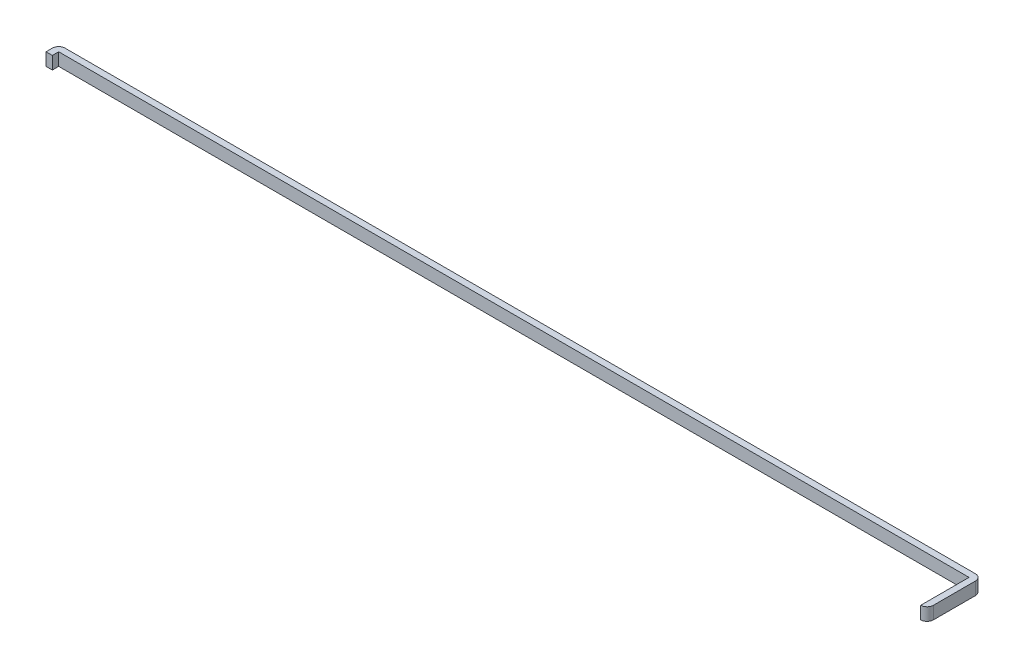
ISO-10303-21;
HEADER;
FILE_DESCRIPTION(('STEP AP214'),'2;1');
FILE_NAME('part.step','',(''),(''),'','','');
FILE_SCHEMA(('AUTOMOTIVE_DESIGN { 1 0 10303 214 1 1 1 1 }'));
ENDSEC;
DATA;
#1=APPLICATION_CONTEXT('core data for automotive mechanical design processes');
#2=APPLICATION_PROTOCOL_DEFINITION('international standard','automotive_design',2000,#1);
#3=PRODUCT_CONTEXT('',#1,'mechanical');
#4=PRODUCT('Part','Part','',(#3));
#5=PRODUCT_RELATED_PRODUCT_CATEGORY('part','',(#4));
#6=PRODUCT_DEFINITION_FORMATION('','',#4);
#7=PRODUCT_DEFINITION_CONTEXT('part definition',#1,'design');
#8=PRODUCT_DEFINITION('design','',#6,#7);
#9=PRODUCT_DEFINITION_SHAPE('','',#8);
#10=(LENGTH_UNIT() NAMED_UNIT(*) SI_UNIT(.MILLI.,.METRE.));
#11=(NAMED_UNIT(*) PLANE_ANGLE_UNIT() SI_UNIT($,.RADIAN.));
#12=(NAMED_UNIT(*) SI_UNIT($,.STERADIAN.) SOLID_ANGLE_UNIT());
#13=UNCERTAINTY_MEASURE_WITH_UNIT(LENGTH_MEASURE(1.E-05),#10,'distance_accuracy_value','');
#14=(GEOMETRIC_REPRESENTATION_CONTEXT(3) GLOBAL_UNCERTAINTY_ASSIGNED_CONTEXT((#13)) GLOBAL_UNIT_ASSIGNED_CONTEXT((#10,
#11,#12)) REPRESENTATION_CONTEXT('',''));
#15=CARTESIAN_POINT('',(0.,0.,0.));
#16=DIRECTION('',(0.,0.,1.));
#17=DIRECTION('',(1.,0.,0.));
#18=AXIS2_PLACEMENT_3D('',#15,#16,#17);
#19=CARTESIAN_POINT('',(-14.366,-5.00619,0.20019));
#20=DIRECTION('',(0.,0.,-1.));
#21=DIRECTION('',(-1.,0.,0.));
#22=AXIS2_PLACEMENT_3D('',#19,#20,#21);
#23=PLANE('',#22);
#24=DIRECTION('',(0.,1.,0.));
#25=VECTOR('',#24,1.);
#26=CARTESIAN_POINT('',(14.376,-5.00619,0.20019));
#27=LINE('',#26,#25);
#28=CARTESIAN_POINT('',(14.376,-5.00619,0.20019));
#29=VERTEX_POINT('',#28);
#30=CARTESIAN_POINT('',(14.376,-4.60581,0.20019));
#31=VERTEX_POINT('',#30);
#32=EDGE_CURVE('E125',#29,#31,#27,.T.);
#33=ORIENTED_EDGE('',*,*,#32,.T.);
#34=DIRECTION('',(1.,0.,0.));
#35=VECTOR('',#34,1.);
#36=CARTESIAN_POINT('',(14.376,-4.60581,0.20019));
#37=LINE('',#36,#35);
#38=CARTESIAN_POINT('',(-14.366,-4.60581,0.20019));
#39=VERTEX_POINT('',#38);
#40=EDGE_CURVE('E112',#31,#39,#37,.F.);
#41=ORIENTED_EDGE('',*,*,#40,.T.);
#42=DIRECTION('',(0.,1.,0.));
#43=VECTOR('',#42,1.);
#44=CARTESIAN_POINT('',(-14.366,-5.00619,0.20019));
#45=LINE('',#44,#43);
#46=CARTESIAN_POINT('',(-14.366,-5.00619,0.20019));
#47=VERTEX_POINT('',#46);
#48=EDGE_CURVE('E108',#39,#47,#45,.F.);
#49=ORIENTED_EDGE('',*,*,#48,.T.);
#50=DIRECTION('',(1.,0.,0.));
#51=VECTOR('',#50,1.);
#52=CARTESIAN_POINT('',(14.376,-5.00619,0.20019));
#53=LINE('',#52,#51);
#54=EDGE_CURVE('E126',#29,#47,#53,.F.);
#55=ORIENTED_EDGE('',*,*,#54,.F.);
#56=EDGE_LOOP('',(#33,#41,#49,#55));
#57=FACE_BOUND('',#56,.T.);
#58=ADVANCED_FACE('F17',(#57),#23,.F.);
#59=CARTESIAN_POINT('',(-14.366,-5.00619,0.40038));
#60=DIRECTION('',(-1.,0.,0.));
#61=DIRECTION('',(0.,0.,1.));
#62=AXIS2_PLACEMENT_3D('',#59,#60,#61);
#63=PLANE('',#62);
#64=ORIENTED_EDGE('',*,*,#48,.F.);
#65=DIRECTION('',(0.,0.,-1.));
#66=VECTOR('',#65,1.);
#67=CARTESIAN_POINT('',(-14.366,-4.60581,0.20019));
#68=LINE('',#67,#66);
#69=CARTESIAN_POINT('',(-14.366,-4.60581,0.40038));
#70=VERTEX_POINT('',#69);
#71=EDGE_CURVE('E120',#39,#70,#68,.F.);
#72=ORIENTED_EDGE('',*,*,#71,.T.);
#73=DIRECTION('',(0.,1.,0.));
#74=VECTOR('',#73,1.);
#75=CARTESIAN_POINT('',(-14.366,-5.00619,0.40038));
#76=LINE('',#75,#74);
#77=CARTESIAN_POINT('',(-14.366,-5.00619,0.40038));
#78=VERTEX_POINT('',#77);
#79=EDGE_CURVE('E177',#70,#78,#76,.F.);
#80=ORIENTED_EDGE('',*,*,#79,.T.);
#81=DIRECTION('',(0.,0.,-1.));
#82=VECTOR('',#81,1.);
#83=CARTESIAN_POINT('',(-14.366,-5.00619,0.20019));
#84=LINE('',#83,#82);
#85=EDGE_CURVE('E168',#47,#78,#84,.F.);
#86=ORIENTED_EDGE('',*,*,#85,.F.);
#87=EDGE_LOOP('',(#64,#72,#80,#86));
#88=FACE_BOUND('',#87,.T.);
#89=ADVANCED_FACE('F227',(#88),#63,.F.);
#90=CARTESIAN_POINT('',(-14.56619,-5.00619,0.40038));
#91=DIRECTION('',(0.,0.,-1.));
#92=DIRECTION('',(-1.,0.,0.));
#93=AXIS2_PLACEMENT_3D('',#90,#91,#92);
#94=PLANE('',#93);
#95=ORIENTED_EDGE('',*,*,#79,.F.);
#96=DIRECTION('',(1.,0.,0.));
#97=VECTOR('',#96,1.);
#98=CARTESIAN_POINT('',(14.376,-4.60581,0.40038));
#99=LINE('',#98,#97);
#100=CARTESIAN_POINT('',(-14.56619,-4.60581,0.40038));
#101=VERTEX_POINT('',#100);
#102=EDGE_CURVE('E145',#70,#101,#99,.F.);
#103=ORIENTED_EDGE('',*,*,#102,.T.);
#104=DIRECTION('',(0.,1.,0.));
#105=VECTOR('',#104,1.);
#106=CARTESIAN_POINT('',(-14.56619,-5.00619,0.40038));
#107=LINE('',#106,#105);
#108=CARTESIAN_POINT('',(-14.56619,-5.00619,0.40038));
#109=VERTEX_POINT('',#108);
#110=EDGE_CURVE('E184',#101,#109,#107,.F.);
#111=ORIENTED_EDGE('',*,*,#110,.T.);
#112=DIRECTION('',(1.,0.,0.));
#113=VECTOR('',#112,1.);
#114=CARTESIAN_POINT('',(14.376,-5.00619,0.40038));
#115=LINE('',#114,#113);
#116=EDGE_CURVE('E86',#78,#109,#115,.F.);
#117=ORIENTED_EDGE('',*,*,#116,.F.);
#118=EDGE_LOOP('',(#95,#103,#111,#117));
#119=FACE_BOUND('',#118,.T.);
#120=ADVANCED_FACE('F226',(#119),#94,.F.);
#121=CARTESIAN_POINT('',(-14.56619,-5.00619,0.20019));
#122=DIRECTION('',(1.,0.,0.));
#123=DIRECTION('',(0.,0.,-1.));
#124=AXIS2_PLACEMENT_3D('',#121,#122,#123);
#125=PLANE('',#124);
#126=ORIENTED_EDGE('',*,*,#110,.F.);
#127=DIRECTION('',(0.,0.,-1.));
#128=VECTOR('',#127,1.);
#129=CARTESIAN_POINT('',(-14.56619,-4.60581,0.20019));
#130=LINE('',#129,#128);
#131=CARTESIAN_POINT('',(-14.56619,-4.60581,0.20019));
#132=VERTEX_POINT('',#131);
#133=EDGE_CURVE('E148',#101,#132,#130,.T.);
#134=ORIENTED_EDGE('',*,*,#133,.T.);
#135=DIRECTION('',(0.,-1.,0.));
#136=VECTOR('',#135,1.);
#137=CARTESIAN_POINT('',(-14.56619,-5.00619,0.20019));
#138=LINE('',#137,#136);
#139=CARTESIAN_POINT('',(-14.56619,-5.00619,0.20019));
#140=VERTEX_POINT('',#139);
#141=EDGE_CURVE('E134',#140,#132,#138,.F.);
#142=ORIENTED_EDGE('',*,*,#141,.F.);
#143=DIRECTION('',(0.,0.,-1.));
#144=VECTOR('',#143,1.);
#145=CARTESIAN_POINT('',(-14.56619,-5.00619,0.20019));
#146=LINE('',#145,#144);
#147=EDGE_CURVE('E80',#109,#140,#146,.T.);
#148=ORIENTED_EDGE('',*,*,#147,.F.);
#149=EDGE_LOOP('',(#126,#134,#142,#148));
#150=FACE_BOUND('',#149,.T.);
#151=ADVANCED_FACE('F224',(#150),#125,.F.);
#152=CARTESIAN_POINT('',(14.57619,-5.00619,1.524905));
#153=DIRECTION('',(-1.,0.,0.));
#154=DIRECTION('',(0.,0.,1.));
#155=AXIS2_PLACEMENT_3D('',#152,#153,#154);
#156=PLANE('',#155);
#157=DIRECTION('',(0.,-1.,0.));
#158=VECTOR('',#157,1.);
#159=CARTESIAN_POINT('',(14.57619,-5.00619,0.20019));
#160=LINE('',#159,#158);
#161=CARTESIAN_POINT('',(14.57619,-4.60581,0.20019));
#162=VERTEX_POINT('',#161);
#163=CARTESIAN_POINT('',(14.57619,-5.00619,0.20019));
#164=VERTEX_POINT('',#163);
#165=EDGE_CURVE('E74',#162,#164,#160,.T.);
#166=ORIENTED_EDGE('',*,*,#165,.F.);
#167=DIRECTION('',(0.,0.,-1.));
#168=VECTOR('',#167,1.);
#169=CARTESIAN_POINT('',(14.57619,-4.60581,0.20019));
#170=LINE('',#169,#168);
#171=CARTESIAN_POINT('',(14.57619,-4.60581,1.524905));
#172=VERTEX_POINT('',#171);
#173=EDGE_CURVE('E139',#162,#172,#170,.F.);
#174=ORIENTED_EDGE('',*,*,#173,.T.);
#175=DIRECTION('',(0.,-1.,0.));
#176=VECTOR('',#175,1.);
#177=CARTESIAN_POINT('',(14.57619,-5.00619,1.524905));
#178=LINE('',#177,#176);
#179=CARTESIAN_POINT('',(14.57619,-5.00619,1.524905));
#180=VERTEX_POINT('',#179);
#181=EDGE_CURVE('E190',#180,#172,#178,.F.);
#182=ORIENTED_EDGE('',*,*,#181,.F.);
#183=DIRECTION('',(0.,0.,-1.));
#184=VECTOR('',#183,1.);
#185=CARTESIAN_POINT('',(14.57619,-5.00619,0.20019));
#186=LINE('',#185,#184);
#187=EDGE_CURVE('E160',#164,#180,#186,.F.);
#188=ORIENTED_EDGE('',*,*,#187,.F.);
#189=EDGE_LOOP('',(#166,#174,#182,#188));
#190=FACE_BOUND('',#189,.T.);
#191=ADVANCED_FACE('F216',(#190),#156,.F.);
#192=CARTESIAN_POINT('',(14.376,-5.00619,1.524905));
#193=DIRECTION('',(0.,-1.,0.));
#194=DIRECTION('',(0.,0.,-1.));
#195=AXIS2_PLACEMENT_3D('',#192,#193,#194);
#196=CYLINDRICAL_SURFACE('',#195,0.20019);
#197=CARTESIAN_POINT('',(14.376,-4.60581,1.524905));
#198=DIRECTION('',(0.,-1.,0.));
#199=DIRECTION('',(0.,0.,-1.));
#200=AXIS2_PLACEMENT_3D('',#197,#198,#199);
#201=CIRCLE('',#200,0.20019);
#202=CARTESIAN_POINT('',(14.376,-4.60581,1.725095));
#203=VERTEX_POINT('',#202);
#204=EDGE_CURVE('E135',#172,#203,#201,.T.);
#205=ORIENTED_EDGE('',*,*,#204,.T.);
#206=DIRECTION('',(0.,1.,0.));
#207=VECTOR('',#206,1.);
#208=CARTESIAN_POINT('',(14.376,-5.00619,1.725095));
#209=LINE('',#208,#207);
#210=CARTESIAN_POINT('',(14.376,-5.00619,1.725095));
#211=VERTEX_POINT('',#210);
#212=EDGE_CURVE('E129',#203,#211,#209,.F.);
#213=ORIENTED_EDGE('',*,*,#212,.T.);
#214=CARTESIAN_POINT('',(14.376,-5.00619,1.524905));
#215=DIRECTION('',(0.,-1.,0.));
#216=DIRECTION('',(0.,0.,-1.));
#217=AXIS2_PLACEMENT_3D('',#214,#215,#216);
#218=CIRCLE('',#217,0.20019);
#219=EDGE_CURVE('E156',#180,#211,#218,.T.);
#220=ORIENTED_EDGE('',*,*,#219,.F.);
#221=ORIENTED_EDGE('',*,*,#181,.T.);
#222=EDGE_LOOP('',(#205,#213,#220,#221));
#223=FACE_BOUND('',#222,.T.);
#224=ADVANCED_FACE('F218',(#223),#196,.T.);
#225=CARTESIAN_POINT('',(14.376,-5.00619,0.20019));
#226=DIRECTION('',(1.,0.,0.));
#227=DIRECTION('',(0.,0.,-1.));
#228=AXIS2_PLACEMENT_3D('',#225,#226,#227);
#229=PLANE('',#228);
#230=DIRECTION('',(0.,0.,-1.));
#231=VECTOR('',#230,1.);
#232=CARTESIAN_POINT('',(14.376,-5.00619,0.20019));
#233=LINE('',#232,#231);
#234=EDGE_CURVE('E159',#211,#29,#233,.T.);
#235=ORIENTED_EDGE('',*,*,#234,.F.);
#236=ORIENTED_EDGE('',*,*,#212,.F.);
#237=DIRECTION('',(0.,0.,-1.));
#238=VECTOR('',#237,1.);
#239=CARTESIAN_POINT('',(14.376,-4.60581,0.20019));
#240=LINE('',#239,#238);
#241=EDGE_CURVE('E117',#203,#31,#240,.T.);
#242=ORIENTED_EDGE('',*,*,#241,.T.);
#243=ORIENTED_EDGE('',*,*,#32,.F.);
#244=EDGE_LOOP('',(#235,#236,#242,#243));
#245=FACE_BOUND('',#244,.T.);
#246=ADVANCED_FACE('F131',(#245),#229,.F.);
#247=CARTESIAN_POINT('',(14.376,-5.00619,0.20019));
#248=DIRECTION('',(0.,-1.,0.));
#249=DIRECTION('',(0.,0.,-1.));
#250=AXIS2_PLACEMENT_3D('',#247,#248,#249);
#251=CYLINDRICAL_SURFACE('',#250,0.20019);
#252=CARTESIAN_POINT('',(14.376,-4.60581,0.20019));
#253=DIRECTION('',(0.,-1.,0.));
#254=DIRECTION('',(0.,0.,-1.));
#255=AXIS2_PLACEMENT_3D('',#252,#253,#254);
#256=CIRCLE('',#255,0.20019);
#257=CARTESIAN_POINT('',(14.376,-4.60581,0.));
#258=VERTEX_POINT('',#257);
#259=EDGE_CURVE('E20',#258,#162,#256,.T.);
#260=ORIENTED_EDGE('',*,*,#259,.T.);
#261=ORIENTED_EDGE('',*,*,#165,.T.);
#262=CARTESIAN_POINT('',(14.376,-5.00619,0.20019));
#263=DIRECTION('',(0.,-1.,0.));
#264=DIRECTION('',(0.,0.,-1.));
#265=AXIS2_PLACEMENT_3D('',#262,#263,#264);
#266=CIRCLE('',#265,0.20019);
#267=CARTESIAN_POINT('',(14.376,-5.00619,0.));
#268=VERTEX_POINT('',#267);
#269=EDGE_CURVE('E161',#268,#164,#266,.T.);
#270=ORIENTED_EDGE('',*,*,#269,.F.);
#271=DIRECTION('',(0.,1.,0.));
#272=VECTOR('',#271,1.);
#273=CARTESIAN_POINT('',(14.376,-5.00619,0.));
#274=LINE('',#273,#272);
#275=EDGE_CURVE('E64',#268,#258,#274,.T.);
#276=ORIENTED_EDGE('',*,*,#275,.T.);
#277=EDGE_LOOP('',(#260,#261,#270,#276));
#278=FACE_BOUND('',#277,.T.);
#279=ADVANCED_FACE('F219',(#278),#251,.T.);
#280=CARTESIAN_POINT('',(14.376,-4.60581,0.20019));
#281=DIRECTION('',(0.,-1.,0.));
#282=DIRECTION('',(0.,0.,-1.));
#283=AXIS2_PLACEMENT_3D('',#280,#281,#282);
#284=PLANE('',#283);
#285=ORIENTED_EDGE('',*,*,#241,.F.);
#286=ORIENTED_EDGE('',*,*,#204,.F.);
#287=ORIENTED_EDGE('',*,*,#173,.F.);
#288=ORIENTED_EDGE('',*,*,#259,.F.);
#289=DIRECTION('',(1.,0.,0.));
#290=VECTOR('',#289,1.);
#291=CARTESIAN_POINT('',(14.376,-4.60581,0.));
#292=LINE('',#291,#290);
#293=CARTESIAN_POINT('',(-14.366,-4.60581,0.));
#294=VERTEX_POINT('',#293);
#295=EDGE_CURVE('E204',#258,#294,#292,.F.);
#296=ORIENTED_EDGE('',*,*,#295,.T.);
#297=CARTESIAN_POINT('',(-14.366,-4.60581,0.20019));
#298=DIRECTION('',(0.,-1.,0.));
#299=DIRECTION('',(0.,0.,-1.));
#300=AXIS2_PLACEMENT_3D('',#297,#298,#299);
#301=CIRCLE('',#300,0.20019);
#302=EDGE_CURVE('E137',#132,#294,#301,.T.);
#303=ORIENTED_EDGE('',*,*,#302,.F.);
#304=ORIENTED_EDGE('',*,*,#133,.F.);
#305=ORIENTED_EDGE('',*,*,#102,.F.);
#306=ORIENTED_EDGE('',*,*,#71,.F.);
#307=ORIENTED_EDGE('',*,*,#40,.F.);
#308=EDGE_LOOP('',(#285,#286,#287,#288,#296,#303,#304,#305,#306,#307));
#309=FACE_BOUND('',#308,.T.);
#310=ADVANCED_FACE('F114',(#309),#284,.F.);
#311=CARTESIAN_POINT('',(-14.366,-5.00619,0.20019));
#312=DIRECTION('',(0.,-1.,0.));
#313=DIRECTION('',(0.,0.,-1.));
#314=AXIS2_PLACEMENT_3D('',#311,#312,#313);
#315=CYLINDRICAL_SURFACE('',#314,0.20019);
#316=ORIENTED_EDGE('',*,*,#302,.T.);
#317=DIRECTION('',(0.,1.,0.));
#318=VECTOR('',#317,1.);
#319=CARTESIAN_POINT('',(-14.366,-5.00619,0.));
#320=LINE('',#319,#318);
#321=CARTESIAN_POINT('',(-14.366,-5.00619,0.));
#322=VERTEX_POINT('',#321);
#323=EDGE_CURVE('E26',#294,#322,#320,.F.);
#324=ORIENTED_EDGE('',*,*,#323,.T.);
#325=CARTESIAN_POINT('',(-14.366,-5.00619,0.20019));
#326=DIRECTION('',(0.,-1.,0.));
#327=DIRECTION('',(0.,0.,-1.));
#328=AXIS2_PLACEMENT_3D('',#325,#326,#327);
#329=CIRCLE('',#328,0.20019);
#330=EDGE_CURVE('E34',#140,#322,#329,.T.);
#331=ORIENTED_EDGE('',*,*,#330,.F.);
#332=ORIENTED_EDGE('',*,*,#141,.T.);
#333=EDGE_LOOP('',(#316,#324,#331,#332));
#334=FACE_BOUND('',#333,.T.);
#335=ADVANCED_FACE('F221',(#334),#315,.T.);
#336=CARTESIAN_POINT('',(14.376,-5.00619,0.20019));
#337=DIRECTION('',(0.,-1.,0.));
#338=DIRECTION('',(0.,0.,-1.));
#339=AXIS2_PLACEMENT_3D('',#336,#337,#338);
#340=PLANE('',#339);
#341=ORIENTED_EDGE('',*,*,#219,.T.);
#342=ORIENTED_EDGE('',*,*,#234,.T.);
#343=ORIENTED_EDGE('',*,*,#54,.T.);
#344=ORIENTED_EDGE('',*,*,#85,.T.);
#345=ORIENTED_EDGE('',*,*,#116,.T.);
#346=ORIENTED_EDGE('',*,*,#147,.T.);
#347=ORIENTED_EDGE('',*,*,#330,.T.);
#348=DIRECTION('',(1.,0.,0.));
#349=VECTOR('',#348,1.);
#350=CARTESIAN_POINT('',(14.376,-5.00619,0.));
#351=LINE('',#350,#349);
#352=EDGE_CURVE('E11',#322,#268,#351,.T.);
#353=ORIENTED_EDGE('',*,*,#352,.T.);
#354=ORIENTED_EDGE('',*,*,#269,.T.);
#355=ORIENTED_EDGE('',*,*,#187,.T.);
#356=EDGE_LOOP('',(#341,#342,#343,#344,#345,#346,#347,#353,#354,#355));
#357=FACE_BOUND('',#356,.T.);
#358=ADVANCED_FACE('F213',(#357),#340,.T.);
#359=CARTESIAN_POINT('',(14.376,-5.00619,0.));
#360=DIRECTION('',(0.,0.,1.));
#361=DIRECTION('',(1.,0.,0.));
#362=AXIS2_PLACEMENT_3D('',#359,#360,#361);
#363=PLANE('',#362);
#364=ORIENTED_EDGE('',*,*,#323,.F.);
#365=ORIENTED_EDGE('',*,*,#295,.F.);
#366=ORIENTED_EDGE('',*,*,#275,.F.);
#367=ORIENTED_EDGE('',*,*,#352,.F.);
#368=EDGE_LOOP('',(#364,#365,#366,#367));
#369=FACE_BOUND('',#368,.T.);
#370=ADVANCED_FACE('F220',(#369),#363,.F.);
#371=CLOSED_SHELL('',(#58,#89,#120,#151,#191,#224,#246,#279,#310,#335,#358,#370));
#372=MANIFOLD_SOLID_BREP('B1',#371);
#373=ADVANCED_BREP_SHAPE_REPRESENTATION('',(#18,#372),#14);
#374=SHAPE_DEFINITION_REPRESENTATION(#9,#373);
ENDSEC;
END-ISO-10303-21;
